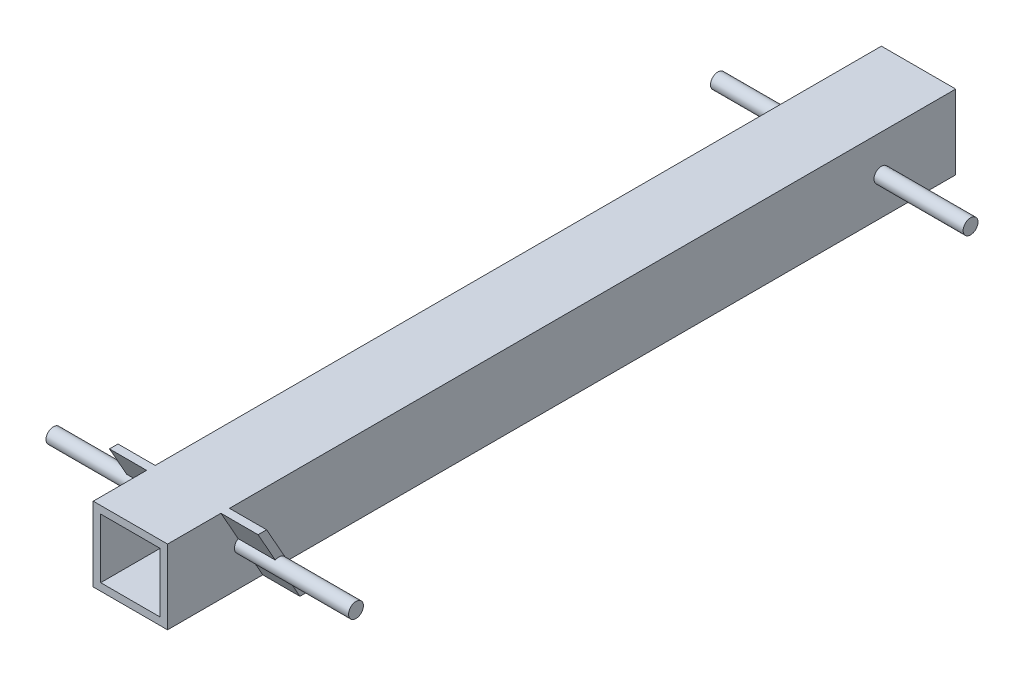
ISO-10303-21;
HEADER;
FILE_DESCRIPTION(('STEP AP214'),'2;1');
FILE_NAME('part.step','',(''),(''),'','','');
FILE_SCHEMA(('AUTOMOTIVE_DESIGN { 1 0 10303 214 1 1 1 1 }'));
ENDSEC;
DATA;
#1=APPLICATION_CONTEXT('core data for automotive mechanical design processes');
#2=APPLICATION_PROTOCOL_DEFINITION('international standard','automotive_design',2000,#1);
#3=PRODUCT_CONTEXT('',#1,'mechanical');
#4=PRODUCT('Part','Part','',(#3));
#5=PRODUCT_RELATED_PRODUCT_CATEGORY('part','',(#4));
#6=PRODUCT_DEFINITION_FORMATION('','',#4);
#7=PRODUCT_DEFINITION_CONTEXT('part definition',#1,'design');
#8=PRODUCT_DEFINITION('design','',#6,#7);
#9=PRODUCT_DEFINITION_SHAPE('','',#8);
#10=(LENGTH_UNIT() NAMED_UNIT(*) SI_UNIT(.MILLI.,.METRE.));
#11=(NAMED_UNIT(*) PLANE_ANGLE_UNIT() SI_UNIT($,.RADIAN.));
#12=(NAMED_UNIT(*) SI_UNIT($,.STERADIAN.) SOLID_ANGLE_UNIT());
#13=UNCERTAINTY_MEASURE_WITH_UNIT(LENGTH_MEASURE(1.E-05),#10,'distance_accuracy_value','');
#14=(GEOMETRIC_REPRESENTATION_CONTEXT(3) GLOBAL_UNCERTAINTY_ASSIGNED_CONTEXT((#13)) GLOBAL_UNIT_ASSIGNED_CONTEXT((#10,
#11,#12)) REPRESENTATION_CONTEXT('',''));
#15=CARTESIAN_POINT('',(0.,0.,0.));
#16=DIRECTION('',(0.,0.,1.));
#17=DIRECTION('',(1.,0.,0.));
#18=AXIS2_PLACEMENT_3D('',#15,#16,#17);
#19=CARTESIAN_POINT('',(0.,0.,106.066));
#20=DIRECTION('',(1.,0.,0.));
#21=DIRECTION('',(0.,0.,-1.));
#22=AXIS2_PLACEMENT_3D('',#19,#20,#21);
#23=PLANE('',#22);
#24=DIRECTION('',(0.,0.,-1.));
#25=VECTOR('',#24,1.);
#26=CARTESIAN_POINT('',(0.,10.,106.066));
#27=LINE('',#26,#25);
#28=CARTESIAN_POINT('',(0.,10.,106.066));
#29=VERTEX_POINT('',#28);
#30=CARTESIAN_POINT('',(0.,10.,98.881));
#31=VERTEX_POINT('',#30);
#32=EDGE_CURVE('E409',#29,#31,#27,.T.);
#33=ORIENTED_EDGE('',*,*,#32,.T.);
#34=DIRECTION('',(0.,-0.871389302087506,-0.490592177075266));
#35=VECTOR('',#34,1.);
#36=CARTESIAN_POINT('',(0.,5.47837116894929,96.3353229681185));
#37=LINE('',#36,#35);
#38=CARTESIAN_POINT('',(0.,5.87138930208749,96.5565921770753));
#39=VERTEX_POINT('',#38);
#40=EDGE_CURVE('E293',#31,#39,#37,.T.);
#41=ORIENTED_EDGE('',*,*,#40,.T.);
#42=CARTESIAN_POINT('',(0.,5.,96.066));
#43=DIRECTION('',(1.,0.,0.));
#44=DIRECTION('',(0.,0.,-1.));
#45=AXIS2_PLACEMENT_3D('',#42,#43,#44);
#46=CIRCLE('',#45,0.999999999999998);
#47=CARTESIAN_POINT('',(0.,4.12861069791249,95.5754078229248));
#48=VERTEX_POINT('',#47);
#49=EDGE_CURVE('E331',#48,#39,#46,.F.);
#50=ORIENTED_EDGE('',*,*,#49,.F.);
#51=CARTESIAN_POINT('',(0.,0.,93.251));
#52=VERTEX_POINT('',#51);
#53=EDGE_CURVE('E59',#48,#52,#37,.T.);
#54=ORIENTED_EDGE('',*,*,#53,.T.);
#55=DIRECTION('',(0.,0.,-1.));
#56=VECTOR('',#55,1.);
#57=CARTESIAN_POINT('',(0.,0.,106.066));
#58=LINE('',#57,#56);
#59=CARTESIAN_POINT('',(0.,0.,106.066));
#60=VERTEX_POINT('',#59);
#61=EDGE_CURVE('E332',#60,#52,#58,.T.);
#62=ORIENTED_EDGE('',*,*,#61,.F.);
#63=DIRECTION('',(0.,-1.,0.));
#64=VECTOR('',#63,1.);
#65=CARTESIAN_POINT('',(0.,0.,106.066));
#66=LINE('',#65,#64);
#67=EDGE_CURVE('E389',#29,#60,#66,.T.);
#68=ORIENTED_EDGE('',*,*,#67,.F.);
#69=EDGE_LOOP('',(#33,#41,#50,#54,#62,#68));
#70=FACE_BOUND('',#69,.T.);
#71=ADVANCED_FACE('F36',(#70),#23,.F.);
#72=CARTESIAN_POINT('',(10.,0.,106.066));
#73=DIRECTION('',(-1.,0.,0.));
#74=DIRECTION('',(0.,0.,1.));
#75=AXIS2_PLACEMENT_3D('',#72,#73,#74);
#76=PLANE('',#75);
#77=DIRECTION('',(0.,0.,-1.));
#78=VECTOR('',#77,1.);
#79=CARTESIAN_POINT('',(10.,0.,106.066));
#80=LINE('',#79,#78);
#81=CARTESIAN_POINT('',(10.,0.,106.066));
#82=VERTEX_POINT('',#81);
#83=CARTESIAN_POINT('',(10.,0.,93.251));
#84=VERTEX_POINT('',#83);
#85=EDGE_CURVE('E416',#82,#84,#80,.T.);
#86=ORIENTED_EDGE('',*,*,#85,.T.);
#87=DIRECTION('',(0.,0.871389302087506,0.490592177075266));
#88=VECTOR('',#87,1.);
#89=CARTESIAN_POINT('',(10.,5.47837116894929,96.3353229681185));
#90=LINE('',#89,#88);
#91=CARTESIAN_POINT('',(10.,4.12861069791249,95.5754078229248));
#92=VERTEX_POINT('',#91);
#93=EDGE_CURVE('E232',#84,#92,#90,.T.);
#94=ORIENTED_EDGE('',*,*,#93,.T.);
#95=CARTESIAN_POINT('',(10.,5.,96.066));
#96=DIRECTION('',(-1.,0.,0.));
#97=DIRECTION('',(0.,0.,1.));
#98=AXIS2_PLACEMENT_3D('',#95,#96,#97);
#99=CIRCLE('',#98,0.999999999999998);
#100=CARTESIAN_POINT('',(10.,5.87138930208749,96.5565921770753));
#101=VERTEX_POINT('',#100);
#102=EDGE_CURVE('E328',#101,#92,#99,.F.);
#103=ORIENTED_EDGE('',*,*,#102,.F.);
#104=CARTESIAN_POINT('',(10.,10.,98.881));
#105=VERTEX_POINT('',#104);
#106=EDGE_CURVE('E298',#101,#105,#90,.T.);
#107=ORIENTED_EDGE('',*,*,#106,.T.);
#108=DIRECTION('',(0.,0.,-1.));
#109=VECTOR('',#108,1.);
#110=CARTESIAN_POINT('',(10.,10.,106.066));
#111=LINE('',#110,#109);
#112=CARTESIAN_POINT('',(10.,10.,106.066));
#113=VERTEX_POINT('',#112);
#114=EDGE_CURVE('E412',#113,#105,#111,.T.);
#115=ORIENTED_EDGE('',*,*,#114,.F.);
#116=DIRECTION('',(0.,1.,0.));
#117=VECTOR('',#116,1.);
#118=CARTESIAN_POINT('',(10.,0.,106.066));
#119=LINE('',#118,#117);
#120=EDGE_CURVE('E395',#82,#113,#119,.T.);
#121=ORIENTED_EDGE('',*,*,#120,.F.);
#122=EDGE_LOOP('',(#86,#94,#103,#107,#115,#121));
#123=FACE_BOUND('',#122,.T.);
#124=ADVANCED_FACE('F436',(#123),#76,.F.);
#125=CARTESIAN_POINT('',(1.,1.,106.066));
#126=DIRECTION('',(1.,0.,0.));
#127=DIRECTION('',(0.,0.,-1.));
#128=AXIS2_PLACEMENT_3D('',#125,#126,#127);
#129=PLANE('',#128);
#130=DIRECTION('',(0.,-0.871389302087506,-0.490592177075266));
#131=VECTOR('',#130,1.);
#132=CARTESIAN_POINT('',(1.,6.23769048474184,96.7628197429097));
#133=LINE('',#132,#131);
#134=CARTESIAN_POINT('',(1.,9.,98.318));
#135=VERTEX_POINT('',#134);
#136=CARTESIAN_POINT('',(1.,5.87138930208749,96.5565921770753));
#137=VERTEX_POINT('',#136);
#138=EDGE_CURVE('E312',#135,#137,#133,.T.);
#139=ORIENTED_EDGE('',*,*,#138,.F.);
#140=DIRECTION('',(0.,0.,-1.));
#141=VECTOR('',#140,1.);
#142=CARTESIAN_POINT('',(1.,9.,106.066));
#143=LINE('',#142,#141);
#144=CARTESIAN_POINT('',(1.,9.,106.066));
#145=VERTEX_POINT('',#144);
#146=EDGE_CURVE('E373',#145,#135,#143,.T.);
#147=ORIENTED_EDGE('',*,*,#146,.F.);
#148=DIRECTION('',(0.,-1.,0.));
#149=VECTOR('',#148,1.);
#150=CARTESIAN_POINT('',(1.,1.,106.066));
#151=LINE('',#150,#149);
#152=CARTESIAN_POINT('',(1.,1.,106.066));
#153=VERTEX_POINT('',#152);
#154=EDGE_CURVE('E352',#145,#153,#151,.T.);
#155=ORIENTED_EDGE('',*,*,#154,.T.);
#156=DIRECTION('',(0.,0.,-1.));
#157=VECTOR('',#156,1.);
#158=CARTESIAN_POINT('',(1.,1.,106.066));
#159=LINE('',#158,#157);
#160=CARTESIAN_POINT('',(1.,1.,93.814));
#161=VERTEX_POINT('',#160);
#162=EDGE_CURVE('E385',#153,#161,#159,.T.);
#163=ORIENTED_EDGE('',*,*,#162,.T.);
#164=CARTESIAN_POINT('',(1.,4.12861069791249,95.5754078229248));
#165=VERTEX_POINT('',#164);
#166=EDGE_CURVE('E309',#165,#161,#133,.T.);
#167=ORIENTED_EDGE('',*,*,#166,.F.);
#168=CARTESIAN_POINT('',(1.,5.,96.066));
#169=DIRECTION('',(1.,0.,0.));
#170=DIRECTION('',(0.,0.,-1.));
#171=AXIS2_PLACEMENT_3D('',#168,#169,#170);
#172=CIRCLE('',#171,0.999999999999998);
#173=EDGE_CURVE('E324',#165,#137,#172,.F.);
#174=ORIENTED_EDGE('',*,*,#173,.T.);
#175=EDGE_LOOP('',(#139,#147,#155,#163,#167,#174));
#176=FACE_BOUND('',#175,.T.);
#177=ADVANCED_FACE('F452',(#176),#129,.T.);
#178=CARTESIAN_POINT('',(1.,1.,106.066));
#179=DIRECTION('',(0.,1.,0.));
#180=DIRECTION('',(0.,0.,1.));
#181=AXIS2_PLACEMENT_3D('',#178,#179,#180);
#182=PLANE('',#181);
#183=DIRECTION('',(1.,0.,0.));
#184=VECTOR('',#183,1.);
#185=CARTESIAN_POINT('',(1.,1.,93.814));
#186=LINE('',#185,#184);
#187=CARTESIAN_POINT('',(9.,1.,93.814));
#188=VERTEX_POINT('',#187);
#189=EDGE_CURVE('E306',#161,#188,#186,.T.);
#190=ORIENTED_EDGE('',*,*,#189,.F.);
#191=ORIENTED_EDGE('',*,*,#162,.F.);
#192=DIRECTION('',(1.,0.,0.));
#193=VECTOR('',#192,1.);
#194=CARTESIAN_POINT('',(1.,1.,106.066));
#195=LINE('',#194,#193);
#196=CARTESIAN_POINT('',(9.,1.,106.066));
#197=VERTEX_POINT('',#196);
#198=EDGE_CURVE('E354',#153,#197,#195,.T.);
#199=ORIENTED_EDGE('',*,*,#198,.T.);
#200=DIRECTION('',(0.,0.,-1.));
#201=VECTOR('',#200,1.);
#202=CARTESIAN_POINT('',(9.,1.,106.066));
#203=LINE('',#202,#201);
#204=EDGE_CURVE('E381',#197,#188,#203,.T.);
#205=ORIENTED_EDGE('',*,*,#204,.T.);
#206=EDGE_LOOP('',(#190,#191,#199,#205));
#207=FACE_BOUND('',#206,.T.);
#208=ADVANCED_FACE('F511',(#207),#182,.T.);
#209=CARTESIAN_POINT('',(9.,1.,106.066));
#210=DIRECTION('',(-1.,0.,0.));
#211=DIRECTION('',(0.,-1.,0.));
#212=AXIS2_PLACEMENT_3D('',#209,#210,#211);
#213=PLANE('',#212);
#214=DIRECTION('',(0.,0.871389302087506,0.490592177075266));
#215=VECTOR('',#214,1.);
#216=CARTESIAN_POINT('',(9.,6.23769048474184,96.7628197429097));
#217=LINE('',#216,#215);
#218=CARTESIAN_POINT('',(9.,4.12861069791249,95.5754078229248));
#219=VERTEX_POINT('',#218);
#220=EDGE_CURVE('E304',#188,#219,#217,.T.);
#221=ORIENTED_EDGE('',*,*,#220,.F.);
#222=ORIENTED_EDGE('',*,*,#204,.F.);
#223=DIRECTION('',(0.,1.,0.));
#224=VECTOR('',#223,1.);
#225=CARTESIAN_POINT('',(9.,1.,106.066));
#226=LINE('',#225,#224);
#227=CARTESIAN_POINT('',(9.,9.,106.066));
#228=VERTEX_POINT('',#227);
#229=EDGE_CURVE('E357',#197,#228,#226,.T.);
#230=ORIENTED_EDGE('',*,*,#229,.T.);
#231=DIRECTION('',(0.,0.,-1.));
#232=VECTOR('',#231,1.);
#233=CARTESIAN_POINT('',(9.,9.,106.066));
#234=LINE('',#233,#232);
#235=CARTESIAN_POINT('',(9.,9.,98.318));
#236=VERTEX_POINT('',#235);
#237=EDGE_CURVE('E377',#228,#236,#234,.T.);
#238=ORIENTED_EDGE('',*,*,#237,.T.);
#239=CARTESIAN_POINT('',(9.,5.87138930208749,96.5565921770753));
#240=VERTEX_POINT('',#239);
#241=EDGE_CURVE('E307',#240,#236,#217,.T.);
#242=ORIENTED_EDGE('',*,*,#241,.F.);
#243=CARTESIAN_POINT('',(9.,5.,96.066));
#244=DIRECTION('',(-1.,0.,0.));
#245=DIRECTION('',(0.,-1.,0.));
#246=AXIS2_PLACEMENT_3D('',#243,#244,#245);
#247=CIRCLE('',#246,0.999999999999998);
#248=EDGE_CURVE('E323',#240,#219,#247,.F.);
#249=ORIENTED_EDGE('',*,*,#248,.T.);
#250=EDGE_LOOP('',(#221,#222,#230,#238,#242,#249));
#251=FACE_BOUND('',#250,.T.);
#252=ADVANCED_FACE('F504',(#251),#213,.T.);
#253=CARTESIAN_POINT('',(1.,9.,106.066));
#254=DIRECTION('',(0.,-1.,0.));
#255=DIRECTION('',(0.,0.,-1.));
#256=AXIS2_PLACEMENT_3D('',#253,#254,#255);
#257=PLANE('',#256);
#258=DIRECTION('',(-1.,0.,0.));
#259=VECTOR('',#258,1.);
#260=CARTESIAN_POINT('',(1.,9.,98.318));
#261=LINE('',#260,#259);
#262=EDGE_CURVE('E315',#236,#135,#261,.T.);
#263=ORIENTED_EDGE('',*,*,#262,.F.);
#264=ORIENTED_EDGE('',*,*,#237,.F.);
#265=DIRECTION('',(-1.,0.,0.));
#266=VECTOR('',#265,1.);
#267=CARTESIAN_POINT('',(1.,9.,106.066));
#268=LINE('',#267,#266);
#269=EDGE_CURVE('E360',#228,#145,#268,.T.);
#270=ORIENTED_EDGE('',*,*,#269,.T.);
#271=ORIENTED_EDGE('',*,*,#146,.T.);
#272=EDGE_LOOP('',(#263,#264,#270,#271));
#273=FACE_BOUND('',#272,.T.);
#274=ADVANCED_FACE('F495',(#273),#257,.T.);
#275=CARTESIAN_POINT('',(0.,0.,106.066));
#276=DIRECTION('',(0.,0.,-1.));
#277=DIRECTION('',(-1.,0.,0.));
#278=AXIS2_PLACEMENT_3D('',#275,#276,#277);
#279=PLANE('',#278);
#280=ORIENTED_EDGE('',*,*,#67,.T.);
#281=DIRECTION('',(1.,0.,0.));
#282=VECTOR('',#281,1.);
#283=CARTESIAN_POINT('',(0.,0.,106.066));
#284=LINE('',#283,#282);
#285=EDGE_CURVE('E392',#60,#82,#284,.T.);
#286=ORIENTED_EDGE('',*,*,#285,.T.);
#287=ORIENTED_EDGE('',*,*,#120,.T.);
#288=DIRECTION('',(-1.,0.,0.));
#289=VECTOR('',#288,1.);
#290=CARTESIAN_POINT('',(0.,10.,106.066));
#291=LINE('',#290,#289);
#292=EDGE_CURVE('E397',#113,#29,#291,.T.);
#293=ORIENTED_EDGE('',*,*,#292,.T.);
#294=EDGE_LOOP('',(#280,#286,#287,#293));
#295=FACE_BOUND('',#294,.T.);
#296=ORIENTED_EDGE('',*,*,#154,.F.);
#297=ORIENTED_EDGE('',*,*,#269,.F.);
#298=ORIENTED_EDGE('',*,*,#229,.F.);
#299=ORIENTED_EDGE('',*,*,#198,.F.);
#300=EDGE_LOOP('',(#296,#297,#298,#299));
#301=FACE_BOUND('',#300,.T.);
#302=ADVANCED_FACE('F443',(#295,#301),#279,.F.);
#303=CARTESIAN_POINT('',(0.,0.,0.));
#304=DIRECTION('',(0.,0.,-1.));
#305=DIRECTION('',(-1.,0.,0.));
#306=AXIS2_PLACEMENT_3D('',#303,#304,#305);
#307=PLANE('',#306);
#308=DIRECTION('',(0.,-1.,0.));
#309=VECTOR('',#308,1.);
#310=CARTESIAN_POINT('',(0.,0.,0.));
#311=LINE('',#310,#309);
#312=CARTESIAN_POINT('',(0.,10.,0.));
#313=VERTEX_POINT('',#312);
#314=CARTESIAN_POINT('',(0.,0.,0.));
#315=VERTEX_POINT('',#314);
#316=EDGE_CURVE('E388',#313,#315,#311,.T.);
#317=ORIENTED_EDGE('',*,*,#316,.F.);
#318=DIRECTION('',(-1.,0.,0.));
#319=VECTOR('',#318,1.);
#320=CARTESIAN_POINT('',(0.,10.,0.));
#321=LINE('',#320,#319);
#322=CARTESIAN_POINT('',(10.,10.,0.));
#323=VERTEX_POINT('',#322);
#324=EDGE_CURVE('E393',#323,#313,#321,.T.);
#325=ORIENTED_EDGE('',*,*,#324,.F.);
#326=DIRECTION('',(0.,1.,0.));
#327=VECTOR('',#326,1.);
#328=CARTESIAN_POINT('',(10.,0.,0.));
#329=LINE('',#328,#327);
#330=CARTESIAN_POINT('',(10.,0.,0.));
#331=VERTEX_POINT('',#330);
#332=EDGE_CURVE('E404',#331,#323,#329,.T.);
#333=ORIENTED_EDGE('',*,*,#332,.F.);
#334=DIRECTION('',(1.,0.,0.));
#335=VECTOR('',#334,1.);
#336=CARTESIAN_POINT('',(0.,0.,0.));
#337=LINE('',#336,#335);
#338=EDGE_CURVE('E401',#315,#331,#337,.T.);
#339=ORIENTED_EDGE('',*,*,#338,.F.);
#340=EDGE_LOOP('',(#317,#325,#333,#339));
#341=FACE_BOUND('',#340,.T.);
#342=DIRECTION('',(-1.,0.,0.));
#343=VECTOR('',#342,1.);
#344=CARTESIAN_POINT('',(1.,9.,0.));
#345=LINE('',#344,#343);
#346=CARTESIAN_POINT('',(9.,9.,0.));
#347=VERTEX_POINT('',#346);
#348=CARTESIAN_POINT('',(1.,9.,0.));
#349=VERTEX_POINT('',#348);
#350=EDGE_CURVE('E355',#347,#349,#345,.T.);
#351=ORIENTED_EDGE('',*,*,#350,.T.);
#352=DIRECTION('',(0.,-1.,0.));
#353=VECTOR('',#352,1.);
#354=CARTESIAN_POINT('',(1.,1.,0.));
#355=LINE('',#354,#353);
#356=CARTESIAN_POINT('',(1.,1.,0.));
#357=VERTEX_POINT('',#356);
#358=EDGE_CURVE('E351',#349,#357,#355,.T.);
#359=ORIENTED_EDGE('',*,*,#358,.T.);
#360=DIRECTION('',(1.,0.,0.));
#361=VECTOR('',#360,1.);
#362=CARTESIAN_POINT('',(1.,1.,0.));
#363=LINE('',#362,#361);
#364=CARTESIAN_POINT('',(9.,1.,0.));
#365=VERTEX_POINT('',#364);
#366=EDGE_CURVE('E365',#357,#365,#363,.T.);
#367=ORIENTED_EDGE('',*,*,#366,.T.);
#368=DIRECTION('',(0.,1.,0.));
#369=VECTOR('',#368,1.);
#370=CARTESIAN_POINT('',(9.,1.,0.));
#371=LINE('',#370,#369);
#372=EDGE_CURVE('E368',#365,#347,#371,.T.);
#373=ORIENTED_EDGE('',*,*,#372,.T.);
#374=EDGE_LOOP('',(#351,#359,#367,#373));
#375=FACE_BOUND('',#374,.T.);
#376=ADVANCED_FACE('F456',(#341,#375),#307,.T.);
#377=CARTESIAN_POINT('',(0.,0.,92.1034073022191));
#378=VERTEX_POINT('',#377);
#379=EDGE_CURVE('E51',#378,#315,#58,.T.);
#380=ORIENTED_EDGE('',*,*,#379,.F.);
#381=DIRECTION('',(0.,0.871389302087506,0.490592177075266));
#382=VECTOR('',#381,1.);
#383=CARTESIAN_POINT('',(0.,5.96896334602457,95.463933666031));
#384=LINE('',#383,#382);
#385=CARTESIAN_POINT('',(0.,10.,97.7334073022191));
#386=VERTEX_POINT('',#385);
#387=EDGE_CURVE('E278',#378,#386,#384,.T.);
#388=ORIENTED_EDGE('',*,*,#387,.T.);
#389=EDGE_CURVE('E399',#386,#313,#27,.T.);
#390=ORIENTED_EDGE('',*,*,#389,.T.);
#391=ORIENTED_EDGE('',*,*,#316,.T.);
#392=EDGE_LOOP('',(#380,#388,#390,#391));
#393=FACE_BOUND('',#392,.T.);
#394=CARTESIAN_POINT('',(0.,5.,10.));
#395=DIRECTION('',(1.,0.,0.));
#396=DIRECTION('',(0.,0.,-1.));
#397=AXIS2_PLACEMENT_3D('',#394,#395,#396);
#398=CIRCLE('',#397,1.);
#399=CARTESIAN_POINT('',(0.,5.,9.));
#400=VERTEX_POINT('',#399);
#401=EDGE_CURVE('E341',#400,#400,#398,.T.);
#402=ORIENTED_EDGE('',*,*,#401,.T.);
#403=EDGE_LOOP('',(#402));
#404=FACE_BOUND('',#403,.T.);
#405=ADVANCED_FACE('F38',(#393,#404),#23,.F.);
#406=CARTESIAN_POINT('',(0.,0.,106.066));
#407=DIRECTION('',(0.,1.,0.));
#408=DIRECTION('',(0.,0.,1.));
#409=AXIS2_PLACEMENT_3D('',#406,#407,#408);
#410=PLANE('',#409);
#411=CARTESIAN_POINT('',(10.,0.,92.1034073022191));
#412=VERTEX_POINT('',#411);
#413=EDGE_CURVE('E415',#412,#331,#80,.T.);
#414=ORIENTED_EDGE('',*,*,#413,.F.);
#415=DIRECTION('',(1.,0.,0.));
#416=VECTOR('',#415,1.);
#417=CARTESIAN_POINT('',(-5.,0.,92.1034073022191));
#418=LINE('',#417,#416);
#419=CARTESIAN_POINT('',(15.,0.,92.1034073022191));
#420=VERTEX_POINT('',#419);
#421=EDGE_CURVE('E242',#412,#420,#418,.T.);
#422=ORIENTED_EDGE('',*,*,#421,.T.);
#423=DIRECTION('',(0.,0.,-1.));
#424=VECTOR('',#423,1.);
#425=CARTESIAN_POINT('',(15.,0.,0.));
#426=LINE('',#425,#424);
#427=CARTESIAN_POINT('',(15.,0.,93.251));
#428=VERTEX_POINT('',#427);
#429=EDGE_CURVE('E221',#428,#420,#426,.T.);
#430=ORIENTED_EDGE('',*,*,#429,.F.);
#431=DIRECTION('',(1.,0.,0.));
#432=VECTOR('',#431,1.);
#433=CARTESIAN_POINT('',(-5.,0.,93.251));
#434=LINE('',#433,#432);
#435=EDGE_CURVE('E229',#84,#428,#434,.T.);
#436=ORIENTED_EDGE('',*,*,#435,.F.);
#437=ORIENTED_EDGE('',*,*,#85,.F.);
#438=ORIENTED_EDGE('',*,*,#285,.F.);
#439=ORIENTED_EDGE('',*,*,#61,.T.);
#440=CARTESIAN_POINT('',(-5.,0.,93.251));
#441=VERTEX_POINT('',#440);
#442=EDGE_CURVE('E236',#441,#52,#434,.T.);
#443=ORIENTED_EDGE('',*,*,#442,.F.);
#444=DIRECTION('',(0.,0.,-1.));
#445=VECTOR('',#444,1.);
#446=CARTESIAN_POINT('',(-5.,0.,0.));
#447=LINE('',#446,#445);
#448=CARTESIAN_POINT('',(-5.,0.,92.1034073022191));
#449=VERTEX_POINT('',#448);
#450=EDGE_CURVE('E256',#441,#449,#447,.T.);
#451=ORIENTED_EDGE('',*,*,#450,.T.);
#452=EDGE_CURVE('E274',#449,#378,#418,.T.);
#453=ORIENTED_EDGE('',*,*,#452,.T.);
#454=ORIENTED_EDGE('',*,*,#379,.T.);
#455=ORIENTED_EDGE('',*,*,#338,.T.);
#456=EDGE_LOOP('',(#414,#422,#430,#436,#437,#438,#439,#443,#451,#453,#454,#455));
#457=FACE_BOUND('',#456,.T.);
#458=ADVANCED_FACE('F240',(#457),#410,.F.);
#459=CARTESIAN_POINT('',(10.,10.,97.7334073022191));
#460=VERTEX_POINT('',#459);
#461=EDGE_CURVE('E411',#460,#323,#111,.T.);
#462=ORIENTED_EDGE('',*,*,#461,.F.);
#463=DIRECTION('',(0.,-0.871389302087506,-0.490592177075266));
#464=VECTOR('',#463,1.);
#465=CARTESIAN_POINT('',(10.,5.96896334602457,95.463933666031));
#466=LINE('',#465,#464);
#467=EDGE_CURVE('E280',#460,#412,#466,.T.);
#468=ORIENTED_EDGE('',*,*,#467,.T.);
#469=ORIENTED_EDGE('',*,*,#413,.T.);
#470=ORIENTED_EDGE('',*,*,#332,.T.);
#471=EDGE_LOOP('',(#462,#468,#469,#470));
#472=FACE_BOUND('',#471,.T.);
#473=CARTESIAN_POINT('',(10.,5.,10.));
#474=DIRECTION('',(1.,0.,0.));
#475=DIRECTION('',(0.,0.,-1.));
#476=AXIS2_PLACEMENT_3D('',#473,#474,#475);
#477=CIRCLE('',#476,1.);
#478=CARTESIAN_POINT('',(10.,5.,9.));
#479=VERTEX_POINT('',#478);
#480=EDGE_CURVE('E344',#479,#479,#477,.T.);
#481=ORIENTED_EDGE('',*,*,#480,.F.);
#482=EDGE_LOOP('',(#481));
#483=FACE_BOUND('',#482,.T.);
#484=ADVANCED_FACE('F454',(#472,#483),#76,.F.);
#485=CARTESIAN_POINT('',(0.,10.,106.066));
#486=DIRECTION('',(0.,-1.,0.));
#487=DIRECTION('',(0.,0.,-1.));
#488=AXIS2_PLACEMENT_3D('',#485,#486,#487);
#489=PLANE('',#488);
#490=ORIENTED_EDGE('',*,*,#389,.F.);
#491=DIRECTION('',(1.,0.,0.));
#492=VECTOR('',#491,1.);
#493=CARTESIAN_POINT('',(-5.,10.,97.7334073022191));
#494=LINE('',#493,#492);
#495=CARTESIAN_POINT('',(-5.,10.,97.7334073022191));
#496=VERTEX_POINT('',#495);
#497=EDGE_CURVE('E270',#496,#386,#494,.T.);
#498=ORIENTED_EDGE('',*,*,#497,.F.);
#499=DIRECTION('',(0.,0.,1.));
#500=VECTOR('',#499,1.);
#501=CARTESIAN_POINT('',(-5.,10.,0.));
#502=LINE('',#501,#500);
#503=CARTESIAN_POINT('',(-5.,10.,98.881));
#504=VERTEX_POINT('',#503);
#505=EDGE_CURVE('E237',#496,#504,#502,.T.);
#506=ORIENTED_EDGE('',*,*,#505,.T.);
#507=DIRECTION('',(1.,0.,0.));
#508=VECTOR('',#507,1.);
#509=CARTESIAN_POINT('',(-5.,10.,98.881));
#510=LINE('',#509,#508);
#511=EDGE_CURVE('E265',#504,#31,#510,.T.);
#512=ORIENTED_EDGE('',*,*,#511,.T.);
#513=ORIENTED_EDGE('',*,*,#32,.F.);
#514=ORIENTED_EDGE('',*,*,#292,.F.);
#515=ORIENTED_EDGE('',*,*,#114,.T.);
#516=CARTESIAN_POINT('',(15.,10.,98.881));
#517=VERTEX_POINT('',#516);
#518=EDGE_CURVE('E269',#105,#517,#510,.T.);
#519=ORIENTED_EDGE('',*,*,#518,.T.);
#520=DIRECTION('',(0.,0.,1.));
#521=VECTOR('',#520,1.);
#522=CARTESIAN_POINT('',(15.,10.,0.));
#523=LINE('',#522,#521);
#524=CARTESIAN_POINT('',(15.,10.,97.7334073022191));
#525=VERTEX_POINT('',#524);
#526=EDGE_CURVE('E249',#525,#517,#523,.T.);
#527=ORIENTED_EDGE('',*,*,#526,.F.);
#528=EDGE_CURVE('E273',#460,#525,#494,.T.);
#529=ORIENTED_EDGE('',*,*,#528,.F.);
#530=ORIENTED_EDGE('',*,*,#461,.T.);
#531=ORIENTED_EDGE('',*,*,#324,.T.);
#532=EDGE_LOOP('',(#490,#498,#506,#512,#513,#514,#515,#519,#527,#529,#530,#531));
#533=FACE_BOUND('',#532,.T.);
#534=ADVANCED_FACE('F581',(#533),#489,.F.);
#535=DIRECTION('',(0.,0.871389302087506,0.490592177075266));
#536=VECTOR('',#535,1.);
#537=CARTESIAN_POINT('',(1.,6.72828266181712,95.8914304408222));
#538=LINE('',#537,#536);
#539=CARTESIAN_POINT('',(1.,1.,92.6664073022191));
#540=VERTEX_POINT('',#539);
#541=CARTESIAN_POINT('',(1.,9.,97.1704073022191));
#542=VERTEX_POINT('',#541);
#543=EDGE_CURVE('E287',#540,#542,#538,.T.);
#544=ORIENTED_EDGE('',*,*,#543,.F.);
#545=EDGE_CURVE('E384',#540,#357,#159,.T.);
#546=ORIENTED_EDGE('',*,*,#545,.T.);
#547=ORIENTED_EDGE('',*,*,#358,.F.);
#548=EDGE_CURVE('E362',#542,#349,#143,.T.);
#549=ORIENTED_EDGE('',*,*,#548,.F.);
#550=EDGE_LOOP('',(#544,#546,#547,#549));
#551=FACE_BOUND('',#550,.T.);
#552=CARTESIAN_POINT('',(1.,5.,10.));
#553=DIRECTION('',(1.,0.,0.));
#554=DIRECTION('',(0.,0.,-1.));
#555=AXIS2_PLACEMENT_3D('',#552,#553,#554);
#556=CIRCLE('',#555,1.);
#557=CARTESIAN_POINT('',(1.,5.,9.));
#558=VERTEX_POINT('',#557);
#559=EDGE_CURVE('E348',#558,#558,#556,.T.);
#560=ORIENTED_EDGE('',*,*,#559,.F.);
#561=EDGE_LOOP('',(#560));
#562=FACE_BOUND('',#561,.T.);
#563=ADVANCED_FACE('F508',(#551,#562),#129,.T.);
#564=DIRECTION('',(-1.,0.,0.));
#565=VECTOR('',#564,1.);
#566=CARTESIAN_POINT('',(1.,1.,92.6664073022191));
#567=LINE('',#566,#565);
#568=CARTESIAN_POINT('',(9.,1.,92.6664073022191));
#569=VERTEX_POINT('',#568);
#570=EDGE_CURVE('E268',#569,#540,#567,.T.);
#571=ORIENTED_EDGE('',*,*,#570,.F.);
#572=EDGE_CURVE('E380',#569,#365,#203,.T.);
#573=ORIENTED_EDGE('',*,*,#572,.T.);
#574=ORIENTED_EDGE('',*,*,#366,.F.);
#575=ORIENTED_EDGE('',*,*,#545,.F.);
#576=EDGE_LOOP('',(#571,#573,#574,#575));
#577=FACE_BOUND('',#576,.T.);
#578=ADVANCED_FACE('F501',(#577),#182,.T.);
#579=DIRECTION('',(0.,-0.871389302087506,-0.490592177075266));
#580=VECTOR('',#579,1.);
#581=CARTESIAN_POINT('',(9.,6.72828266181712,95.8914304408222));
#582=LINE('',#581,#580);
#583=CARTESIAN_POINT('',(9.,9.,97.1704073022191));
#584=VERTEX_POINT('',#583);
#585=EDGE_CURVE('E282',#584,#569,#582,.T.);
#586=ORIENTED_EDGE('',*,*,#585,.F.);
#587=EDGE_CURVE('E376',#584,#347,#234,.T.);
#588=ORIENTED_EDGE('',*,*,#587,.T.);
#589=ORIENTED_EDGE('',*,*,#372,.F.);
#590=ORIENTED_EDGE('',*,*,#572,.F.);
#591=EDGE_LOOP('',(#586,#588,#589,#590));
#592=FACE_BOUND('',#591,.T.);
#593=CARTESIAN_POINT('',(9.,5.,10.));
#594=DIRECTION('',(-1.,0.,0.));
#595=DIRECTION('',(0.,-1.,0.));
#596=AXIS2_PLACEMENT_3D('',#593,#594,#595);
#597=CIRCLE('',#596,1.);
#598=CARTESIAN_POINT('',(9.,4.,10.));
#599=VERTEX_POINT('',#598);
#600=EDGE_CURVE('E347',#599,#599,#597,.T.);
#601=ORIENTED_EDGE('',*,*,#600,.F.);
#602=EDGE_LOOP('',(#601));
#603=FACE_BOUND('',#602,.T.);
#604=ADVANCED_FACE('F493',(#592,#603),#213,.T.);
#605=DIRECTION('',(1.,0.,0.));
#606=VECTOR('',#605,1.);
#607=CARTESIAN_POINT('',(1.,9.,97.1704073022191));
#608=LINE('',#607,#606);
#609=EDGE_CURVE('E284',#542,#584,#608,.T.);
#610=ORIENTED_EDGE('',*,*,#609,.F.);
#611=ORIENTED_EDGE('',*,*,#548,.T.);
#612=ORIENTED_EDGE('',*,*,#350,.F.);
#613=ORIENTED_EDGE('',*,*,#587,.F.);
#614=EDGE_LOOP('',(#610,#611,#612,#613));
#615=FACE_BOUND('',#614,.T.);
#616=ADVANCED_FACE('F486',(#615),#257,.T.);
#617=CARTESIAN_POINT('',(22.,5.,10.));
#618=DIRECTION('',(-1.,0.,0.));
#619=DIRECTION('',(0.,0.,1.));
#620=AXIS2_PLACEMENT_3D('',#617,#618,#619);
#621=CYLINDRICAL_SURFACE('',#620,1.);
#622=ORIENTED_EDGE('',*,*,#559,.T.);
#623=EDGE_LOOP('',(#622));
#624=FACE_BOUND('',#623,.T.);
#625=ORIENTED_EDGE('',*,*,#600,.T.);
#626=EDGE_LOOP('',(#625));
#627=FACE_BOUND('',#626,.T.);
#628=ADVANCED_FACE('F472',(#624,#627),#621,.T.);
#629=CARTESIAN_POINT('',(22.,0.,0.));
#630=DIRECTION('',(1.,0.,0.));
#631=DIRECTION('',(0.,0.,-1.));
#632=AXIS2_PLACEMENT_3D('',#629,#630,#631);
#633=PLANE('',#632);
#634=CARTESIAN_POINT('',(22.,5.,10.));
#635=DIRECTION('',(1.,0.,0.));
#636=DIRECTION('',(0.,0.,-1.));
#637=AXIS2_PLACEMENT_3D('',#634,#635,#636);
#638=CIRCLE('',#637,1.);
#639=CARTESIAN_POINT('',(22.,5.,9.));
#640=VERTEX_POINT('',#639);
#641=EDGE_CURVE('E338',#640,#640,#638,.F.);
#642=ORIENTED_EDGE('',*,*,#641,.F.);
#643=EDGE_LOOP('',(#642));
#644=FACE_BOUND('',#643,.T.);
#645=ADVANCED_FACE('F480',(#644),#633,.T.);
#646=ORIENTED_EDGE('',*,*,#641,.T.);
#647=EDGE_LOOP('',(#646));
#648=FACE_BOUND('',#647,.T.);
#649=ORIENTED_EDGE('',*,*,#480,.T.);
#650=EDGE_LOOP('',(#649));
#651=FACE_BOUND('',#650,.T.);
#652=ADVANCED_FACE('F469',(#648,#651),#621,.T.);
#653=CARTESIAN_POINT('',(-12.,5.,10.));
#654=DIRECTION('',(1.,0.,0.));
#655=DIRECTION('',(0.,0.,-1.));
#656=AXIS2_PLACEMENT_3D('',#653,#654,#655);
#657=CIRCLE('',#656,1.);
#658=CARTESIAN_POINT('',(-12.,5.,9.));
#659=VERTEX_POINT('',#658);
#660=EDGE_CURVE('E327',#659,#659,#657,.F.);
#661=ORIENTED_EDGE('',*,*,#660,.F.);
#662=EDGE_LOOP('',(#661));
#663=FACE_BOUND('',#662,.T.);
#664=ORIENTED_EDGE('',*,*,#401,.F.);
#665=EDGE_LOOP('',(#664));
#666=FACE_BOUND('',#665,.T.);
#667=ADVANCED_FACE('F466',(#663,#666),#621,.T.);
#668=CARTESIAN_POINT('',(-12.,0.,0.));
#669=DIRECTION('',(1.,0.,0.));
#670=DIRECTION('',(0.,0.,-1.));
#671=AXIS2_PLACEMENT_3D('',#668,#669,#670);
#672=PLANE('',#671);
#673=ORIENTED_EDGE('',*,*,#660,.T.);
#674=EDGE_LOOP('',(#673));
#675=FACE_BOUND('',#674,.T.);
#676=ADVANCED_FACE('F468',(#675),#672,.F.);
#677=CARTESIAN_POINT('',(25.36,5.,96.066));
#678=DIRECTION('',(-1.,0.,0.));
#679=DIRECTION('',(0.,0.,1.));
#680=AXIS2_PLACEMENT_3D('',#677,#678,#679);
#681=CYLINDRICAL_SURFACE('',#680,0.999999999999998);
#682=ORIENTED_EDGE('',*,*,#248,.F.);
#683=DIRECTION('',(-1.,0.,0.));
#684=VECTOR('',#683,1.);
#685=CARTESIAN_POINT('',(25.36,5.87138930208749,96.5565921770753));
#686=LINE('',#685,#684);
#687=EDGE_CURVE('E311',#240,#137,#686,.T.);
#688=ORIENTED_EDGE('',*,*,#687,.T.);
#689=ORIENTED_EDGE('',*,*,#173,.F.);
#690=DIRECTION('',(-1.,0.,0.));
#691=VECTOR('',#690,1.);
#692=CARTESIAN_POINT('',(25.36,4.12861069791249,95.5754078229248));
#693=LINE('',#692,#691);
#694=EDGE_CURVE('E301',#165,#219,#693,.F.);
#695=ORIENTED_EDGE('',*,*,#694,.T.);
#696=EDGE_LOOP('',(#682,#688,#689,#695));
#697=FACE_BOUND('',#696,.T.);
#698=ADVANCED_FACE('F477',(#697),#681,.T.);
#699=CARTESIAN_POINT('',(25.36,0.,0.));
#700=DIRECTION('',(1.,0.,0.));
#701=DIRECTION('',(0.,0.,-1.));
#702=AXIS2_PLACEMENT_3D('',#699,#700,#701);
#703=PLANE('',#702);
#704=CARTESIAN_POINT('',(25.36,5.,96.066));
#705=DIRECTION('',(1.,0.,0.));
#706=DIRECTION('',(0.,0.,-1.));
#707=AXIS2_PLACEMENT_3D('',#704,#705,#706);
#708=CIRCLE('',#707,0.999999999999998);
#709=CARTESIAN_POINT('',(25.36,5.,95.066));
#710=VERTEX_POINT('',#709);
#711=EDGE_CURVE('E320',#710,#710,#708,.T.);
#712=ORIENTED_EDGE('',*,*,#711,.T.);
#713=EDGE_LOOP('',(#712));
#714=FACE_BOUND('',#713,.T.);
#715=ADVANCED_FACE('F609',(#714),#703,.T.);
#716=ORIENTED_EDGE('',*,*,#711,.F.);
#717=EDGE_LOOP('',(#716));
#718=FACE_BOUND('',#717,.T.);
#719=CARTESIAN_POINT('',(15.,5.,96.066));
#720=DIRECTION('',(1.,0.,0.));
#721=DIRECTION('',(0.,0.,-1.));
#722=AXIS2_PLACEMENT_3D('',#719,#720,#721);
#723=CIRCLE('',#722,0.999999999999998);
#724=CARTESIAN_POINT('',(15.,5.49059217707527,95.1946106979125));
#725=VERTEX_POINT('',#724);
#726=CARTESIAN_POINT('',(15.,5.87138930208749,96.5565921770753));
#727=VERTEX_POINT('',#726);
#728=EDGE_CURVE('E11',#725,#727,#723,.T.);
#729=ORIENTED_EDGE('',*,*,#728,.T.);
#730=DIRECTION('',(-1.,0.,0.));
#731=VECTOR('',#730,1.);
#732=CARTESIAN_POINT('',(25.36,5.87138930208749,96.5565921770753));
#733=LINE('',#732,#731);
#734=EDGE_CURVE('E297',#727,#101,#733,.T.);
#735=ORIENTED_EDGE('',*,*,#734,.T.);
#736=ORIENTED_EDGE('',*,*,#102,.T.);
#737=DIRECTION('',(-1.,0.,0.));
#738=VECTOR('',#737,1.);
#739=CARTESIAN_POINT('',(25.36,4.12861069791249,95.5754078229248));
#740=LINE('',#739,#738);
#741=CARTESIAN_POINT('',(15.,4.12861069791249,95.5754078229248));
#742=VERTEX_POINT('',#741);
#743=EDGE_CURVE('E294',#92,#742,#740,.F.);
#744=ORIENTED_EDGE('',*,*,#743,.T.);
#745=EDGE_CURVE('E40',#742,#725,#723,.T.);
#746=ORIENTED_EDGE('',*,*,#745,.T.);
#747=EDGE_LOOP('',(#729,#735,#736,#744,#746));
#748=FACE_BOUND('',#747,.T.);
#749=ADVANCED_FACE('F432',(#718,#748),#681,.T.);
#750=ORIENTED_EDGE('',*,*,#49,.T.);
#751=DIRECTION('',(-1.,0.,0.));
#752=VECTOR('',#751,1.);
#753=CARTESIAN_POINT('',(25.36,5.87138930208749,96.5565921770753));
#754=LINE('',#753,#752);
#755=CARTESIAN_POINT('',(-5.,5.87138930208749,96.5565921770753));
#756=VERTEX_POINT('',#755);
#757=EDGE_CURVE('E427',#39,#756,#754,.T.);
#758=ORIENTED_EDGE('',*,*,#757,.T.);
#759=CARTESIAN_POINT('',(-5.,5.,96.066));
#760=DIRECTION('',(1.,0.,0.));
#761=DIRECTION('',(0.,0.,-1.));
#762=AXIS2_PLACEMENT_3D('',#759,#760,#761);
#763=CIRCLE('',#762,0.999999999999998);
#764=CARTESIAN_POINT('',(-5.,5.49059217707527,95.1946106979125));
#765=VERTEX_POINT('',#764);
#766=EDGE_CURVE('E425',#765,#756,#763,.T.);
#767=ORIENTED_EDGE('',*,*,#766,.F.);
#768=CARTESIAN_POINT('',(-5.,4.12861069791249,95.5754078229248));
#769=VERTEX_POINT('',#768);
#770=EDGE_CURVE('E335',#769,#765,#763,.T.);
#771=ORIENTED_EDGE('',*,*,#770,.F.);
#772=DIRECTION('',(-1.,0.,0.));
#773=VECTOR('',#772,1.);
#774=CARTESIAN_POINT('',(25.36,4.12861069791249,95.5754078229248));
#775=LINE('',#774,#773);
#776=EDGE_CURVE('E426',#769,#48,#775,.F.);
#777=ORIENTED_EDGE('',*,*,#776,.T.);
#778=EDGE_LOOP('',(#750,#758,#767,#771,#777));
#779=FACE_BOUND('',#778,.T.);
#780=CARTESIAN_POINT('',(-15.36,5.,96.066));
#781=DIRECTION('',(1.,0.,0.));
#782=DIRECTION('',(0.,0.,-1.));
#783=AXIS2_PLACEMENT_3D('',#780,#781,#782);
#784=CIRCLE('',#783,0.999999999999998);
#785=CARTESIAN_POINT('',(-15.36,5.,95.066));
#786=VERTEX_POINT('',#785);
#787=EDGE_CURVE('E317',#786,#786,#784,.T.);
#788=ORIENTED_EDGE('',*,*,#787,.T.);
#789=EDGE_LOOP('',(#788));
#790=FACE_BOUND('',#789,.T.);
#791=ADVANCED_FACE('F596',(#779,#790),#681,.T.);
#792=CARTESIAN_POINT('',(-15.36,0.,0.));
#793=DIRECTION('',(1.,0.,0.));
#794=DIRECTION('',(0.,0.,-1.));
#795=AXIS2_PLACEMENT_3D('',#792,#793,#794);
#796=PLANE('',#795);
#797=ORIENTED_EDGE('',*,*,#787,.F.);
#798=EDGE_LOOP('',(#797));
#799=FACE_BOUND('',#798,.T.);
#800=ADVANCED_FACE('F599',(#799),#796,.F.);
#801=CARTESIAN_POINT('',(-5.,0.,0.));
#802=DIRECTION('',(1.,0.,0.));
#803=DIRECTION('',(0.,0.,-1.));
#804=AXIS2_PLACEMENT_3D('',#801,#802,#803);
#805=PLANE('',#804);
#806=DIRECTION('',(0.,-0.871389302087506,-0.490592177075266));
#807=VECTOR('',#806,1.);
#808=CARTESIAN_POINT('',(-5.,-39.8645017460548,70.8072855169712));
#809=LINE('',#808,#807);
#810=EDGE_CURVE('E252',#769,#441,#809,.T.);
#811=ORIENTED_EDGE('',*,*,#810,.F.);
#812=ORIENTED_EDGE('',*,*,#770,.T.);
#813=DIRECTION('',(0.,0.871389302087506,0.490592177075266));
#814=VECTOR('',#813,1.);
#815=CARTESIAN_POINT('',(-5.,-39.3739095689795,69.9358962148837));
#816=LINE('',#815,#814);
#817=EDGE_CURVE('E260',#449,#765,#816,.T.);
#818=ORIENTED_EDGE('',*,*,#817,.F.);
#819=ORIENTED_EDGE('',*,*,#450,.F.);
#820=EDGE_LOOP('',(#811,#812,#818,#819));
#821=FACE_BOUND('',#820,.T.);
#822=ADVANCED_FACE('F571',(#821),#805,.F.);
#823=EDGE_CURVE('E259',#765,#496,#816,.T.);
#824=ORIENTED_EDGE('',*,*,#823,.F.);
#825=ORIENTED_EDGE('',*,*,#766,.T.);
#826=EDGE_CURVE('E253',#504,#756,#809,.T.);
#827=ORIENTED_EDGE('',*,*,#826,.F.);
#828=ORIENTED_EDGE('',*,*,#505,.F.);
#829=EDGE_LOOP('',(#824,#825,#827,#828));
#830=FACE_BOUND('',#829,.T.);
#831=ADVANCED_FACE('F564',(#830),#805,.F.);
#832=CARTESIAN_POINT('',(-5.,-39.3739095689795,69.9358962148837));
#833=DIRECTION('',(0.,0.490592177075266,-0.871389302087506));
#834=DIRECTION('',(0.,0.871389302087506,0.490592177075266));
#835=AXIS2_PLACEMENT_3D('',#832,#833,#834);
#836=PLANE('',#835);
#837=ORIENTED_EDGE('',*,*,#387,.F.);
#838=ORIENTED_EDGE('',*,*,#452,.F.);
#839=ORIENTED_EDGE('',*,*,#817,.T.);
#840=ORIENTED_EDGE('',*,*,#823,.T.);
#841=ORIENTED_EDGE('',*,*,#497,.T.);
#842=EDGE_LOOP('',(#837,#838,#839,#840,#841));
#843=FACE_BOUND('',#842,.T.);
#844=ADVANCED_FACE('F554',(#843),#836,.T.);
#845=CARTESIAN_POINT('',(-5.,-39.8645017460548,70.8072855169712));
#846=DIRECTION('',(0.,-0.490592177075266,0.871389302087506));
#847=DIRECTION('',(0.,-0.871389302087506,-0.490592177075266));
#848=AXIS2_PLACEMENT_3D('',#845,#846,#847);
#849=PLANE('',#848);
#850=ORIENTED_EDGE('',*,*,#53,.F.);
#851=ORIENTED_EDGE('',*,*,#776,.F.);
#852=ORIENTED_EDGE('',*,*,#810,.T.);
#853=ORIENTED_EDGE('',*,*,#442,.T.);
#854=EDGE_LOOP('',(#850,#851,#852,#853));
#855=FACE_BOUND('',#854,.T.);
#856=ADVANCED_FACE('F545',(#855),#849,.T.);
#857=ORIENTED_EDGE('',*,*,#40,.F.);
#858=ORIENTED_EDGE('',*,*,#511,.F.);
#859=ORIENTED_EDGE('',*,*,#826,.T.);
#860=ORIENTED_EDGE('',*,*,#757,.F.);
#861=EDGE_LOOP('',(#857,#858,#859,#860));
#862=FACE_BOUND('',#861,.T.);
#863=ADVANCED_FACE('F557',(#862),#849,.T.);
#864=CARTESIAN_POINT('',(15.,0.,0.));
#865=DIRECTION('',(1.,0.,0.));
#866=DIRECTION('',(0.,0.,-1.));
#867=AXIS2_PLACEMENT_3D('',#864,#865,#866);
#868=PLANE('',#867);
#869=ORIENTED_EDGE('',*,*,#745,.F.);
#870=DIRECTION('',(0.,-0.871389302087506,-0.490592177075266));
#871=VECTOR('',#870,1.);
#872=CARTESIAN_POINT('',(15.,-39.8645017460548,70.8072855169712));
#873=LINE('',#872,#871);
#874=EDGE_CURVE('E217',#742,#428,#873,.T.);
#875=ORIENTED_EDGE('',*,*,#874,.T.);
#876=ORIENTED_EDGE('',*,*,#429,.T.);
#877=DIRECTION('',(0.,0.871389302087506,0.490592177075266));
#878=VECTOR('',#877,1.);
#879=CARTESIAN_POINT('',(15.,-39.3739095689795,69.9358962148837));
#880=LINE('',#879,#878);
#881=EDGE_CURVE('E245',#420,#725,#880,.T.);
#882=ORIENTED_EDGE('',*,*,#881,.T.);
#883=EDGE_LOOP('',(#869,#875,#876,#882));
#884=FACE_BOUND('',#883,.T.);
#885=ADVANCED_FACE('F219',(#884),#868,.T.);
#886=ORIENTED_EDGE('',*,*,#93,.F.);
#887=ORIENTED_EDGE('',*,*,#435,.T.);
#888=ORIENTED_EDGE('',*,*,#874,.F.);
#889=ORIENTED_EDGE('',*,*,#743,.F.);
#890=EDGE_LOOP('',(#886,#887,#888,#889));
#891=FACE_BOUND('',#890,.T.);
#892=ADVANCED_FACE('F230',(#891),#849,.T.);
#893=ORIENTED_EDGE('',*,*,#728,.F.);
#894=EDGE_CURVE('E243',#725,#525,#880,.T.);
#895=ORIENTED_EDGE('',*,*,#894,.T.);
#896=ORIENTED_EDGE('',*,*,#526,.T.);
#897=EDGE_CURVE('E226',#517,#727,#873,.T.);
#898=ORIENTED_EDGE('',*,*,#897,.T.);
#899=EDGE_LOOP('',(#893,#895,#896,#898));
#900=FACE_BOUND('',#899,.T.);
#901=ADVANCED_FACE('F590',(#900),#868,.T.);
#902=ORIENTED_EDGE('',*,*,#106,.F.);
#903=ORIENTED_EDGE('',*,*,#734,.F.);
#904=ORIENTED_EDGE('',*,*,#897,.F.);
#905=ORIENTED_EDGE('',*,*,#518,.F.);
#906=EDGE_LOOP('',(#902,#903,#904,#905));
#907=FACE_BOUND('',#906,.T.);
#908=ADVANCED_FACE('F551',(#907),#849,.T.);
#909=ORIENTED_EDGE('',*,*,#467,.F.);
#910=ORIENTED_EDGE('',*,*,#528,.T.);
#911=ORIENTED_EDGE('',*,*,#894,.F.);
#912=ORIENTED_EDGE('',*,*,#881,.F.);
#913=ORIENTED_EDGE('',*,*,#421,.F.);
#914=EDGE_LOOP('',(#909,#910,#911,#912,#913));
#915=FACE_BOUND('',#914,.T.);
#916=ADVANCED_FACE('F543',(#915),#836,.T.);
#917=ORIENTED_EDGE('',*,*,#694,.F.);
#918=ORIENTED_EDGE('',*,*,#166,.T.);
#919=ORIENTED_EDGE('',*,*,#189,.T.);
#920=ORIENTED_EDGE('',*,*,#220,.T.);
#921=EDGE_LOOP('',(#917,#918,#919,#920));
#922=FACE_BOUND('',#921,.T.);
#923=ADVANCED_FACE('F541',(#922),#849,.T.);
#924=ORIENTED_EDGE('',*,*,#241,.T.);
#925=ORIENTED_EDGE('',*,*,#262,.T.);
#926=ORIENTED_EDGE('',*,*,#138,.T.);
#927=ORIENTED_EDGE('',*,*,#687,.F.);
#928=EDGE_LOOP('',(#924,#925,#926,#927));
#929=FACE_BOUND('',#928,.T.);
#930=ADVANCED_FACE('F536',(#929),#849,.T.);
#931=ORIENTED_EDGE('',*,*,#609,.T.);
#932=ORIENTED_EDGE('',*,*,#585,.T.);
#933=ORIENTED_EDGE('',*,*,#570,.T.);
#934=ORIENTED_EDGE('',*,*,#543,.T.);
#935=EDGE_LOOP('',(#931,#932,#933,#934));
#936=FACE_BOUND('',#935,.T.);
#937=ADVANCED_FACE('F550',(#936),#836,.T.);
#938=CLOSED_SHELL('',(#71,#124,#177,#208,#252,#274,#302,#376,#405,#458,#484,#534,#563,#578,#604,
#616,#628,#645,#652,#667,#676,#698,#715,#749,#791,#800,#822,#831,#844,#856,#863,#885,#892,#901,
#908,#916,#923,#930,#937));
#939=MANIFOLD_SOLID_BREP('B2',#938);
#940=ADVANCED_BREP_SHAPE_REPRESENTATION('',(#18,#939),#14);
#941=SHAPE_DEFINITION_REPRESENTATION(#9,#940);
ENDSEC;
END-ISO-10303-21;
